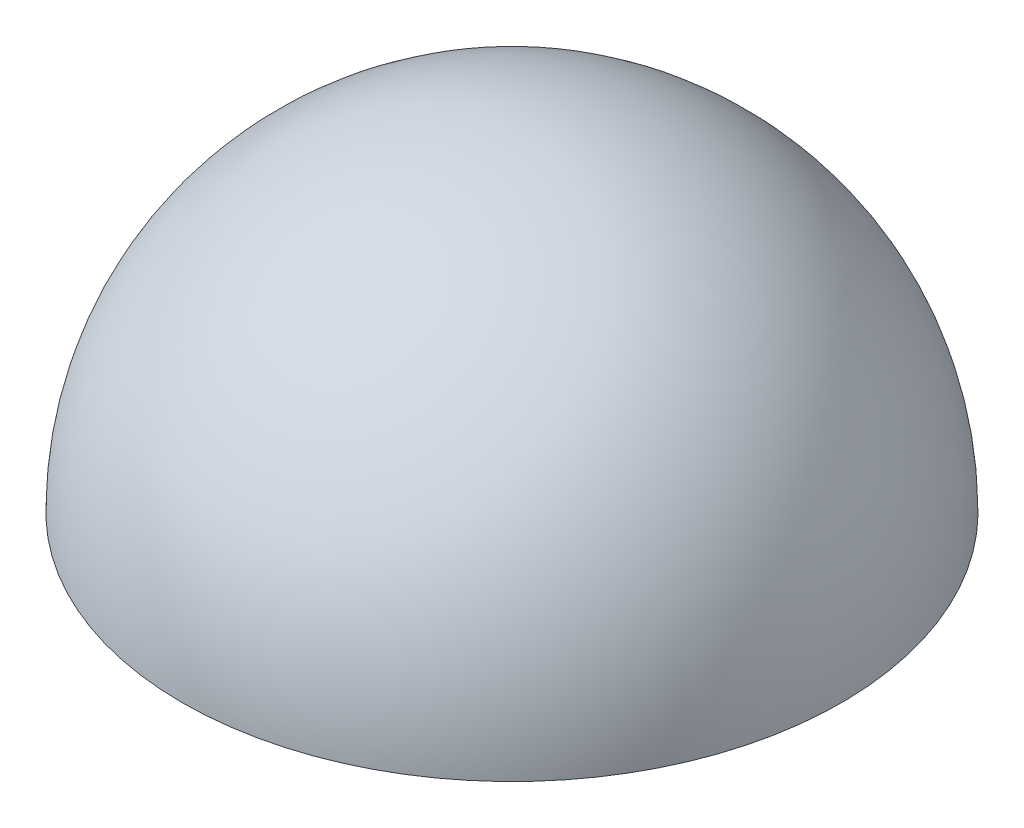
ISO-10303-21;
HEADER;
FILE_DESCRIPTION(('STEP AP214'),'2;1');
FILE_NAME('part.step','',(''),(''),'','','');
FILE_SCHEMA(('AUTOMOTIVE_DESIGN { 1 0 10303 214 1 1 1 1 }'));
ENDSEC;
DATA;
#1=APPLICATION_CONTEXT('core data for automotive mechanical design processes');
#2=APPLICATION_PROTOCOL_DEFINITION('international standard','automotive_design',2000,#1);
#3=PRODUCT_CONTEXT('',#1,'mechanical');
#4=PRODUCT('Part','Part','',(#3));
#5=PRODUCT_RELATED_PRODUCT_CATEGORY('part','',(#4));
#6=PRODUCT_DEFINITION_FORMATION('','',#4);
#7=PRODUCT_DEFINITION_CONTEXT('part definition',#1,'design');
#8=PRODUCT_DEFINITION('design','',#6,#7);
#9=PRODUCT_DEFINITION_SHAPE('','',#8);
#10=(LENGTH_UNIT() NAMED_UNIT(*) SI_UNIT(.MILLI.,.METRE.));
#11=(NAMED_UNIT(*) PLANE_ANGLE_UNIT() SI_UNIT($,.RADIAN.));
#12=(NAMED_UNIT(*) SI_UNIT($,.STERADIAN.) SOLID_ANGLE_UNIT());
#13=UNCERTAINTY_MEASURE_WITH_UNIT(LENGTH_MEASURE(1.E-05),#10,'distance_accuracy_value','');
#14=(GEOMETRIC_REPRESENTATION_CONTEXT(3) GLOBAL_UNCERTAINTY_ASSIGNED_CONTEXT((#13)) GLOBAL_UNIT_ASSIGNED_CONTEXT((#10,
#11,#12)) REPRESENTATION_CONTEXT('',''));
#15=CARTESIAN_POINT('',(0.,0.,0.));
#16=DIRECTION('',(0.,0.,1.));
#17=DIRECTION('',(1.,0.,0.));
#18=AXIS2_PLACEMENT_3D('',#15,#16,#17);
#19=CARTESIAN_POINT('',(0.,0.,0.));
#20=DIRECTION('',(0.,0.,-1.));
#21=DIRECTION('',(1.,0.,0.));
#22=AXIS2_PLACEMENT_3D('',#19,#20,#21);
#23=SPHERICAL_SURFACE('',#22,9.);
#24=CARTESIAN_POINT('',(0.,0.,0.));
#25=DIRECTION('',(0.,1.,0.));
#26=DIRECTION('',(0.,0.,1.));
#27=AXIS2_PLACEMENT_3D('',#24,#25,#26);
#28=SPHERICAL_SURFACE('',#27,9.);
#29=CARTESIAN_POINT('',(0.,0.,0.));
#30=DIRECTION('',(0.,1.,0.));
#31=DIRECTION('',(0.,0.,1.));
#32=AXIS2_PLACEMENT_3D('',#29,#30,#31);
#33=CIRCLE('',#32,9.);
#34=CARTESIAN_POINT('',(0.,0.,9.));
#35=VERTEX_POINT('',#34);
#36=EDGE_CURVE('E10',#35,#35,#33,.F.);
#37=ORIENTED_EDGE('',*,*,#36,.F.);
#38=EDGE_LOOP('',(#37));
#39=FACE_BOUND('',#38,.T.);
#40=ADVANCED_FACE('F43',(#39),#28,.T.);
#41=CARTESIAN_POINT('',(-9.41305085982845,0.,-9.));
#42=DIRECTION('',(0.,1.,0.));
#43=DIRECTION('',(0.,0.,1.));
#44=AXIS2_PLACEMENT_3D('',#41,#42,#43);
#45=PLANE('',#44);
#46=ORIENTED_EDGE('',*,*,#36,.T.);
#47=EDGE_LOOP('',(#46));
#48=FACE_BOUND('',#47,.T.);
#49=ADVANCED_FACE('F51',(#48),#45,.F.);
#50=CLOSED_SHELL('',(#40,#49));
#51=MANIFOLD_SOLID_BREP('B2',#50);
#52=ADVANCED_BREP_SHAPE_REPRESENTATION('',(#18,#51),#14);
#53=SHAPE_DEFINITION_REPRESENTATION(#9,#52);
ENDSEC;
END-ISO-10303-21;
